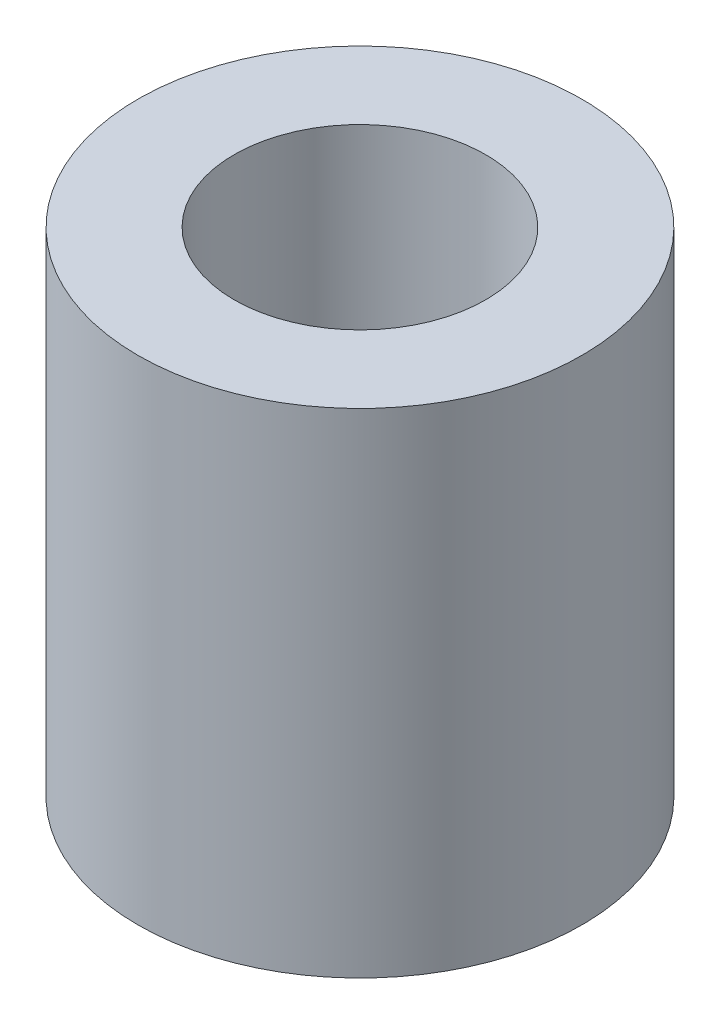
ISO-10303-21;
HEADER;
FILE_DESCRIPTION(('STEP AP214'),'2;1');
FILE_NAME('part.step','',(''),(''),'','','');
FILE_SCHEMA(('AUTOMOTIVE_DESIGN { 1 0 10303 214 1 1 1 1 }'));
ENDSEC;
DATA;
#1=APPLICATION_CONTEXT('core data for automotive mechanical design processes');
#2=APPLICATION_PROTOCOL_DEFINITION('international standard','automotive_design',2000,#1);
#3=PRODUCT_CONTEXT('',#1,'mechanical');
#4=PRODUCT('Part','Part','',(#3));
#5=PRODUCT_RELATED_PRODUCT_CATEGORY('part','',(#4));
#6=PRODUCT_DEFINITION_FORMATION('','',#4);
#7=PRODUCT_DEFINITION_CONTEXT('part definition',#1,'design');
#8=PRODUCT_DEFINITION('design','',#6,#7);
#9=PRODUCT_DEFINITION_SHAPE('','',#8);
#10=(LENGTH_UNIT() NAMED_UNIT(*) SI_UNIT(.MILLI.,.METRE.));
#11=(NAMED_UNIT(*) PLANE_ANGLE_UNIT() SI_UNIT($,.RADIAN.));
#12=(NAMED_UNIT(*) SI_UNIT($,.STERADIAN.) SOLID_ANGLE_UNIT());
#13=UNCERTAINTY_MEASURE_WITH_UNIT(LENGTH_MEASURE(1.E-05),#10,'distance_accuracy_value','');
#14=(GEOMETRIC_REPRESENTATION_CONTEXT(3) GLOBAL_UNCERTAINTY_ASSIGNED_CONTEXT((#13)) GLOBAL_UNIT_ASSIGNED_CONTEXT((#10,
#11,#12)) REPRESENTATION_CONTEXT('',''));
#15=CARTESIAN_POINT('',(0.,0.,0.));
#16=DIRECTION('',(0.,0.,1.));
#17=DIRECTION('',(1.,0.,0.));
#18=AXIS2_PLACEMENT_3D('',#15,#16,#17);
#19=CARTESIAN_POINT('',(0.,10.,0.));
#20=DIRECTION('',(0.,1.,0.));
#21=DIRECTION('',(0.,0.,1.));
#22=AXIS2_PLACEMENT_3D('',#19,#20,#21);
#23=PLANE('',#22);
#24=CARTESIAN_POINT('',(0.,10.,0.));
#25=DIRECTION('',(0.,1.,0.));
#26=DIRECTION('',(0.,0.,1.));
#27=AXIS2_PLACEMENT_3D('',#24,#25,#26);
#28=CIRCLE('',#27,4.5);
#29=CARTESIAN_POINT('',(0.,10.,4.5));
#30=VERTEX_POINT('',#29);
#31=EDGE_CURVE('E10',#30,#30,#28,.T.);
#32=ORIENTED_EDGE('',*,*,#31,.T.);
#33=EDGE_LOOP('',(#32));
#34=FACE_BOUND('',#33,.T.);
#35=CARTESIAN_POINT('',(0.,10.,0.));
#36=DIRECTION('',(0.,1.,0.));
#37=DIRECTION('',(0.,0.,1.));
#38=AXIS2_PLACEMENT_3D('',#35,#36,#37);
#39=CIRCLE('',#38,2.55);
#40=CARTESIAN_POINT('',(0.,10.,2.55));
#41=VERTEX_POINT('',#40);
#42=EDGE_CURVE('E42',#41,#41,#39,.T.);
#43=ORIENTED_EDGE('',*,*,#42,.F.);
#44=EDGE_LOOP('',(#43));
#45=FACE_BOUND('',#44,.T.);
#46=ADVANCED_FACE('F31',(#34,#45),#23,.T.);
#47=CARTESIAN_POINT('',(0.,0.,0.));
#48=DIRECTION('',(0.,1.,0.));
#49=DIRECTION('',(0.,0.,1.));
#50=AXIS2_PLACEMENT_3D('',#47,#48,#49);
#51=PLANE('',#50);
#52=CARTESIAN_POINT('',(0.,0.,0.));
#53=DIRECTION('',(0.,1.,0.));
#54=DIRECTION('',(0.,0.,1.));
#55=AXIS2_PLACEMENT_3D('',#52,#53,#54);
#56=CIRCLE('',#55,4.5);
#57=CARTESIAN_POINT('',(0.,0.,4.5));
#58=VERTEX_POINT('',#57);
#59=EDGE_CURVE('E35',#58,#58,#56,.T.);
#60=ORIENTED_EDGE('',*,*,#59,.F.);
#61=EDGE_LOOP('',(#60));
#62=FACE_BOUND('',#61,.T.);
#63=CARTESIAN_POINT('',(0.,0.,0.));
#64=DIRECTION('',(0.,1.,0.));
#65=DIRECTION('',(0.,0.,1.));
#66=AXIS2_PLACEMENT_3D('',#63,#64,#65);
#67=CIRCLE('',#66,2.55);
#68=CARTESIAN_POINT('',(0.,0.,2.55));
#69=VERTEX_POINT('',#68);
#70=EDGE_CURVE('E44',#69,#69,#67,.T.);
#71=ORIENTED_EDGE('',*,*,#70,.T.);
#72=EDGE_LOOP('',(#71));
#73=FACE_BOUND('',#72,.T.);
#74=ADVANCED_FACE('F54',(#62,#73),#51,.F.);
#75=CARTESIAN_POINT('',(0.,10.,0.));
#76=DIRECTION('',(0.,-1.,0.));
#77=DIRECTION('',(0.,0.,-1.));
#78=AXIS2_PLACEMENT_3D('',#75,#76,#77);
#79=CYLINDRICAL_SURFACE('',#78,4.5);
#80=ORIENTED_EDGE('',*,*,#31,.F.);
#81=EDGE_LOOP('',(#80));
#82=FACE_BOUND('',#81,.T.);
#83=ORIENTED_EDGE('',*,*,#59,.T.);
#84=EDGE_LOOP('',(#83));
#85=FACE_BOUND('',#84,.T.);
#86=ADVANCED_FACE('F33',(#82,#85),#79,.T.);
#87=CARTESIAN_POINT('',(0.,10.,0.));
#88=DIRECTION('',(0.,-1.,0.));
#89=DIRECTION('',(0.,0.,-1.));
#90=AXIS2_PLACEMENT_3D('',#87,#88,#89);
#91=CYLINDRICAL_SURFACE('',#90,2.55);
#92=ORIENTED_EDGE('',*,*,#42,.T.);
#93=EDGE_LOOP('',(#92));
#94=FACE_BOUND('',#93,.T.);
#95=ORIENTED_EDGE('',*,*,#70,.F.);
#96=EDGE_LOOP('',(#95));
#97=FACE_BOUND('',#96,.T.);
#98=ADVANCED_FACE('F50',(#94,#97),#91,.F.);
#99=CLOSED_SHELL('',(#46,#74,#86,#98));
#100=MANIFOLD_SOLID_BREP('B2',#99);
#101=ADVANCED_BREP_SHAPE_REPRESENTATION('',(#18,#100),#14);
#102=SHAPE_DEFINITION_REPRESENTATION(#9,#101);
ENDSEC;
END-ISO-10303-21;
